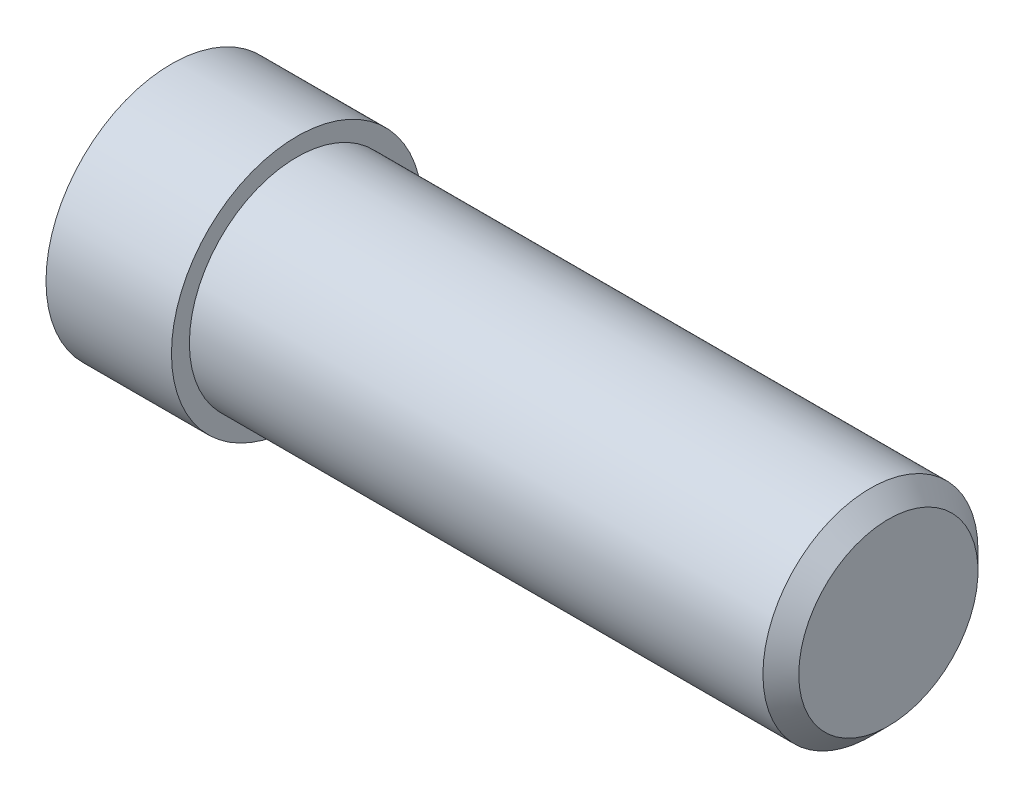
ISO-10303-21;
HEADER;
FILE_DESCRIPTION(('STEP AP214'),'2;1');
FILE_NAME('part.step','',(''),(''),'','','');
FILE_SCHEMA(('AUTOMOTIVE_DESIGN { 1 0 10303 214 1 1 1 1 }'));
ENDSEC;
DATA;
#1=APPLICATION_CONTEXT('core data for automotive mechanical design processes');
#2=APPLICATION_PROTOCOL_DEFINITION('international standard','automotive_design',2000,#1);
#3=PRODUCT_CONTEXT('',#1,'mechanical');
#4=PRODUCT('Part','Part','',(#3));
#5=PRODUCT_RELATED_PRODUCT_CATEGORY('part','',(#4));
#6=PRODUCT_DEFINITION_FORMATION('','',#4);
#7=PRODUCT_DEFINITION_CONTEXT('part definition',#1,'design');
#8=PRODUCT_DEFINITION('design','',#6,#7);
#9=PRODUCT_DEFINITION_SHAPE('','',#8);
#10=(LENGTH_UNIT() NAMED_UNIT(*) SI_UNIT(.MILLI.,.METRE.));
#11=(NAMED_UNIT(*) PLANE_ANGLE_UNIT() SI_UNIT($,.RADIAN.));
#12=(NAMED_UNIT(*) SI_UNIT($,.STERADIAN.) SOLID_ANGLE_UNIT());
#13=UNCERTAINTY_MEASURE_WITH_UNIT(LENGTH_MEASURE(1.E-05),#10,'distance_accuracy_value','');
#14=(GEOMETRIC_REPRESENTATION_CONTEXT(3) GLOBAL_UNCERTAINTY_ASSIGNED_CONTEXT((#13)) GLOBAL_UNIT_ASSIGNED_CONTEXT((#10,
#11,#12)) REPRESENTATION_CONTEXT('',''));
#15=CARTESIAN_POINT('',(0.,0.,0.));
#16=DIRECTION('',(0.,0.,1.));
#17=DIRECTION('',(1.,0.,0.));
#18=AXIS2_PLACEMENT_3D('',#15,#16,#17);
#19=CARTESIAN_POINT('',(0.,0.,0.));
#20=DIRECTION('',(-1.,0.,0.));
#21=DIRECTION('',(0.,0.,1.));
#22=AXIS2_PLACEMENT_3D('',#19,#20,#21);
#23=PLANE('',#22);
#24=CARTESIAN_POINT('',(0.,0.,0.));
#25=DIRECTION('',(-1.,0.,0.));
#26=DIRECTION('',(0.,0.,1.));
#27=AXIS2_PLACEMENT_3D('',#24,#25,#26);
#28=CIRCLE('',#27,4.99999999999999);
#29=CARTESIAN_POINT('',(0.,0.,4.99999999999999));
#30=VERTEX_POINT('',#29);
#31=EDGE_CURVE('E10',#30,#30,#28,.F.);
#32=ORIENTED_EDGE('',*,*,#31,.T.);
#33=EDGE_LOOP('',(#32));
#34=FACE_BOUND('',#33,.T.);
#35=ADVANCED_FACE('F34',(#34),#23,.F.);
#36=CARTESIAN_POINT('',(-40.,0.,0.));
#37=DIRECTION('',(-1.,0.,0.));
#38=DIRECTION('',(0.,0.,1.));
#39=AXIS2_PLACEMENT_3D('',#36,#37,#38);
#40=CYLINDRICAL_SURFACE('',#39,6.);
#41=CARTESIAN_POINT('',(-1.00000000000001,0.,0.));
#42=DIRECTION('',(-1.,0.,0.));
#43=DIRECTION('',(0.,0.,1.));
#44=AXIS2_PLACEMENT_3D('',#41,#42,#43);
#45=CIRCLE('',#44,6.);
#46=CARTESIAN_POINT('',(-1.00000000000001,0.,6.));
#47=VERTEX_POINT('',#46);
#48=EDGE_CURVE('E42',#47,#47,#45,.T.);
#49=ORIENTED_EDGE('',*,*,#48,.T.);
#50=EDGE_LOOP('',(#49));
#51=FACE_BOUND('',#50,.T.);
#52=CARTESIAN_POINT('',(-33.,0.,0.));
#53=DIRECTION('',(-1.,0.,0.));
#54=DIRECTION('',(0.,0.,1.));
#55=AXIS2_PLACEMENT_3D('',#52,#53,#54);
#56=CIRCLE('',#55,6.);
#57=CARTESIAN_POINT('',(-33.,0.,6.));
#58=VERTEX_POINT('',#57);
#59=EDGE_CURVE('E46',#58,#58,#56,.T.);
#60=ORIENTED_EDGE('',*,*,#59,.F.);
#61=EDGE_LOOP('',(#60));
#62=FACE_BOUND('',#61,.T.);
#63=ADVANCED_FACE('F70',(#51,#62),#40,.T.);
#64=CARTESIAN_POINT('',(-33.,6.,0.));
#65=DIRECTION('',(-1.,0.,0.));
#66=DIRECTION('',(0.,0.,1.));
#67=AXIS2_PLACEMENT_3D('',#64,#65,#66);
#68=PLANE('',#67);
#69=CARTESIAN_POINT('',(-33.,0.,0.));
#70=DIRECTION('',(-1.,0.,0.));
#71=DIRECTION('',(0.,0.,1.));
#72=AXIS2_PLACEMENT_3D('',#69,#70,#71);
#73=CIRCLE('',#72,7.);
#74=CARTESIAN_POINT('',(-33.,0.,7.));
#75=VERTEX_POINT('',#74);
#76=EDGE_CURVE('E50',#75,#75,#73,.T.);
#77=ORIENTED_EDGE('',*,*,#76,.F.);
#78=EDGE_LOOP('',(#77));
#79=FACE_BOUND('',#78,.T.);
#80=ORIENTED_EDGE('',*,*,#59,.T.);
#81=EDGE_LOOP('',(#80));
#82=FACE_BOUND('',#81,.T.);
#83=ADVANCED_FACE('F64',(#79,#82),#68,.F.);
#84=CARTESIAN_POINT('',(-40.,0.,0.));
#85=DIRECTION('',(-1.,0.,0.));
#86=DIRECTION('',(0.,0.,1.));
#87=AXIS2_PLACEMENT_3D('',#84,#85,#86);
#88=CYLINDRICAL_SURFACE('',#87,7.);
#89=CARTESIAN_POINT('',(-40.,0.,0.));
#90=DIRECTION('',(-1.,0.,0.));
#91=DIRECTION('',(0.,0.,1.));
#92=AXIS2_PLACEMENT_3D('',#89,#90,#91);
#93=CIRCLE('',#92,7.);
#94=CARTESIAN_POINT('',(-40.,0.,7.));
#95=VERTEX_POINT('',#94);
#96=EDGE_CURVE('E55',#95,#95,#93,.T.);
#97=ORIENTED_EDGE('',*,*,#96,.F.);
#98=EDGE_LOOP('',(#97));
#99=FACE_BOUND('',#98,.T.);
#100=ORIENTED_EDGE('',*,*,#76,.T.);
#101=EDGE_LOOP('',(#100));
#102=FACE_BOUND('',#101,.T.);
#103=ADVANCED_FACE('F61',(#99,#102),#88,.T.);
#104=CARTESIAN_POINT('',(-40.,7.,0.));
#105=DIRECTION('',(1.,0.,0.));
#106=DIRECTION('',(0.,0.,-1.));
#107=AXIS2_PLACEMENT_3D('',#104,#105,#106);
#108=PLANE('',#107);
#109=ORIENTED_EDGE('',*,*,#96,.T.);
#110=EDGE_LOOP('',(#109));
#111=FACE_BOUND('',#110,.T.);
#112=ADVANCED_FACE('F59',(#111),#108,.F.);
#113=CARTESIAN_POINT('',(-1.00000000000001,0.,0.));
#114=DIRECTION('',(-1.,0.,0.));
#115=DIRECTION('',(0.,0.,1.));
#116=AXIS2_PLACEMENT_3D('',#113,#114,#115);
#117=CONICAL_SURFACE('',#116,6.,0.785398163397447);
#118=ORIENTED_EDGE('',*,*,#31,.F.);
#119=EDGE_LOOP('',(#118));
#120=FACE_BOUND('',#119,.T.);
#121=ORIENTED_EDGE('',*,*,#48,.F.);
#122=EDGE_LOOP('',(#121));
#123=FACE_BOUND('',#122,.T.);
#124=ADVANCED_FACE('F37',(#120,#123),#117,.T.);
#125=CLOSED_SHELL('',(#35,#63,#83,#103,#112,#124));
#126=MANIFOLD_SOLID_BREP('B2',#125);
#127=ADVANCED_BREP_SHAPE_REPRESENTATION('',(#18,#126),#14);
#128=SHAPE_DEFINITION_REPRESENTATION(#9,#127);
ENDSEC;
END-ISO-10303-21;
